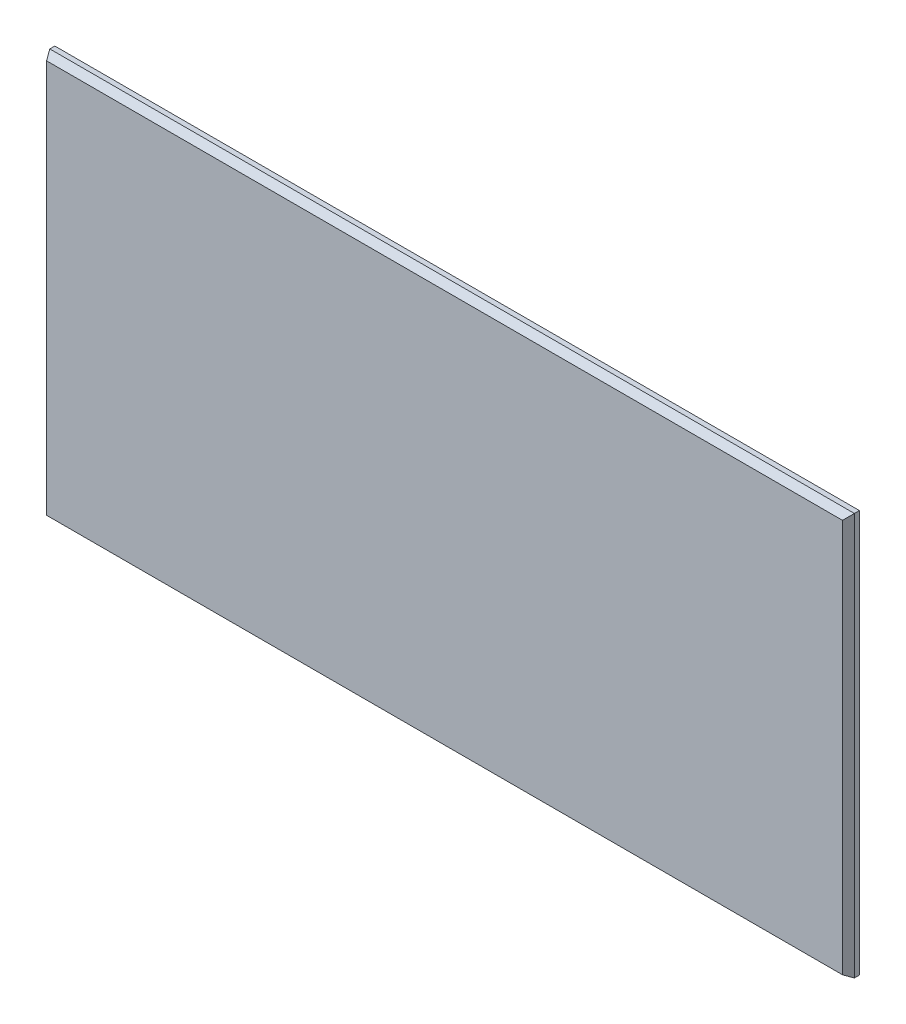
ISO-10303-21;
HEADER;
FILE_DESCRIPTION(('STEP AP214'),'2;1');
FILE_NAME('part.step','',(''),(''),'','','');
FILE_SCHEMA(('AUTOMOTIVE_DESIGN { 1 0 10303 214 1 1 1 1 }'));
ENDSEC;
DATA;
#1=APPLICATION_CONTEXT('core data for automotive mechanical design processes');
#2=APPLICATION_PROTOCOL_DEFINITION('international standard','automotive_design',2000,#1);
#3=PRODUCT_CONTEXT('',#1,'mechanical');
#4=PRODUCT('Part','Part','',(#3));
#5=PRODUCT_RELATED_PRODUCT_CATEGORY('part','',(#4));
#6=PRODUCT_DEFINITION_FORMATION('','',#4);
#7=PRODUCT_DEFINITION_CONTEXT('part definition',#1,'design');
#8=PRODUCT_DEFINITION('design','',#6,#7);
#9=PRODUCT_DEFINITION_SHAPE('','',#8);
#10=(LENGTH_UNIT() NAMED_UNIT(*) SI_UNIT(.MILLI.,.METRE.));
#11=(NAMED_UNIT(*) PLANE_ANGLE_UNIT() SI_UNIT($,.RADIAN.));
#12=(NAMED_UNIT(*) SI_UNIT($,.STERADIAN.) SOLID_ANGLE_UNIT());
#13=UNCERTAINTY_MEASURE_WITH_UNIT(LENGTH_MEASURE(1.E-05),#10,'distance_accuracy_value','');
#14=(GEOMETRIC_REPRESENTATION_CONTEXT(3) GLOBAL_UNCERTAINTY_ASSIGNED_CONTEXT((#13)) GLOBAL_UNIT_ASSIGNED_CONTEXT((#10,
#11,#12)) REPRESENTATION_CONTEXT('',''));
#15=CARTESIAN_POINT('',(0.,0.,0.));
#16=DIRECTION('',(0.,0.,1.));
#17=DIRECTION('',(1.,0.,0.));
#18=AXIS2_PLACEMENT_3D('',#15,#16,#17);
#19=CARTESIAN_POINT('',(-50.8,25.3999999999999,-0.15875));
#20=DIRECTION('',(1.,0.,0.));
#21=DIRECTION('',(0.,0.,-1.));
#22=AXIS2_PLACEMENT_3D('',#19,#20,#21);
#23=PLANE('',#22);
#24=DIRECTION('',(0.,-1.,0.));
#25=VECTOR('',#24,1.);
#26=CARTESIAN_POINT('',(-50.8,25.3999999999999,-0.79375));
#27=LINE('',#26,#25);
#28=CARTESIAN_POINT('',(-50.8,25.3999999999999,-0.79375));
#29=VERTEX_POINT('',#28);
#30=CARTESIAN_POINT('',(-50.8,-25.4000000000001,-0.79375));
#31=VERTEX_POINT('',#30);
#32=EDGE_CURVE('E115',#29,#31,#27,.T.);
#33=ORIENTED_EDGE('',*,*,#32,.T.);
#34=DIRECTION('',(0.,0.,-1.));
#35=VECTOR('',#34,1.);
#36=CARTESIAN_POINT('',(-50.8,-25.4000000000001,-0.15875));
#37=LINE('',#36,#35);
#38=CARTESIAN_POINT('',(-50.8,-25.4000000000001,-0.15875));
#39=VERTEX_POINT('',#38);
#40=EDGE_CURVE('E11',#39,#31,#37,.T.);
#41=ORIENTED_EDGE('',*,*,#40,.F.);
#42=DIRECTION('',(0.,-1.,0.));
#43=VECTOR('',#42,1.);
#44=CARTESIAN_POINT('',(-50.8,25.3999999999999,-0.15875));
#45=LINE('',#44,#43);
#46=CARTESIAN_POINT('',(-50.8,25.3999999999999,-0.15875));
#47=VERTEX_POINT('',#46);
#48=EDGE_CURVE('E94',#47,#39,#45,.T.);
#49=ORIENTED_EDGE('',*,*,#48,.F.);
#50=DIRECTION('',(0.,0.,-1.));
#51=VECTOR('',#50,1.);
#52=CARTESIAN_POINT('',(-50.8,25.3999999999999,-0.15875));
#53=LINE('',#52,#51);
#54=EDGE_CURVE('E96',#47,#29,#53,.T.);
#55=ORIENTED_EDGE('',*,*,#54,.T.);
#56=EDGE_LOOP('',(#33,#41,#49,#55));
#57=FACE_BOUND('',#56,.T.);
#58=ADVANCED_FACE('F34',(#57),#23,.F.);
#59=CARTESIAN_POINT('',(-50.8,-25.4000000000001,-0.15875));
#60=DIRECTION('',(0.,1.,0.));
#61=DIRECTION('',(0.,0.,1.));
#62=AXIS2_PLACEMENT_3D('',#59,#60,#61);
#63=PLANE('',#62);
#64=DIRECTION('',(1.,0.,0.));
#65=VECTOR('',#64,1.);
#66=CARTESIAN_POINT('',(-50.8,-25.4000000000001,-0.79375));
#67=LINE('',#66,#65);
#68=CARTESIAN_POINT('',(50.8,-25.4000000000001,-0.79375));
#69=VERTEX_POINT('',#68);
#70=EDGE_CURVE('E128',#31,#69,#67,.T.);
#71=ORIENTED_EDGE('',*,*,#70,.T.);
#72=DIRECTION('',(0.,0.,-1.));
#73=VECTOR('',#72,1.);
#74=CARTESIAN_POINT('',(50.8,-25.4000000000001,-0.15875));
#75=LINE('',#74,#73);
#76=CARTESIAN_POINT('',(50.8,-25.4000000000001,-0.15875));
#77=VERTEX_POINT('',#76);
#78=EDGE_CURVE('E42',#77,#69,#75,.T.);
#79=ORIENTED_EDGE('',*,*,#78,.F.);
#80=DIRECTION('',(1.,0.,0.));
#81=VECTOR('',#80,1.);
#82=CARTESIAN_POINT('',(-50.8,-25.4000000000001,-0.15875));
#83=LINE('',#82,#81);
#84=EDGE_CURVE('E76',#39,#77,#83,.T.);
#85=ORIENTED_EDGE('',*,*,#84,.F.);
#86=ORIENTED_EDGE('',*,*,#40,.T.);
#87=EDGE_LOOP('',(#71,#79,#85,#86));
#88=FACE_BOUND('',#87,.T.);
#89=ADVANCED_FACE('F135',(#88),#63,.F.);
#90=CARTESIAN_POINT('',(50.8,25.3999999999999,-0.15875));
#91=DIRECTION('',(-1.,0.,0.));
#92=DIRECTION('',(0.,0.,1.));
#93=AXIS2_PLACEMENT_3D('',#90,#91,#92);
#94=PLANE('',#93);
#95=DIRECTION('',(0.,1.,0.));
#96=VECTOR('',#95,1.);
#97=CARTESIAN_POINT('',(50.8,25.3999999999999,-0.79375));
#98=LINE('',#97,#96);
#99=CARTESIAN_POINT('',(50.8,25.3999999999999,-0.79375));
#100=VERTEX_POINT('',#99);
#101=EDGE_CURVE('E66',#69,#100,#98,.T.);
#102=ORIENTED_EDGE('',*,*,#101,.T.);
#103=DIRECTION('',(0.,0.,-1.));
#104=VECTOR('',#103,1.);
#105=CARTESIAN_POINT('',(50.8,25.3999999999999,-0.15875));
#106=LINE('',#105,#104);
#107=CARTESIAN_POINT('',(50.8,25.3999999999999,-0.15875));
#108=VERTEX_POINT('',#107);
#109=EDGE_CURVE('E50',#108,#100,#106,.T.);
#110=ORIENTED_EDGE('',*,*,#109,.F.);
#111=DIRECTION('',(0.,1.,0.));
#112=VECTOR('',#111,1.);
#113=CARTESIAN_POINT('',(50.8,25.3999999999999,-0.15875));
#114=LINE('',#113,#112);
#115=EDGE_CURVE('E122',#77,#108,#114,.T.);
#116=ORIENTED_EDGE('',*,*,#115,.F.);
#117=ORIENTED_EDGE('',*,*,#78,.T.);
#118=EDGE_LOOP('',(#102,#110,#116,#117));
#119=FACE_BOUND('',#118,.T.);
#120=ADVANCED_FACE('F132',(#119),#94,.F.);
#121=CARTESIAN_POINT('',(-50.8,25.3999999999999,-0.15875));
#122=DIRECTION('',(0.,-1.,0.));
#123=DIRECTION('',(0.,0.,-1.));
#124=AXIS2_PLACEMENT_3D('',#121,#122,#123);
#125=PLANE('',#124);
#126=DIRECTION('',(-1.,0.,0.));
#127=VECTOR('',#126,1.);
#128=CARTESIAN_POINT('',(-50.8,25.3999999999999,-0.79375));
#129=LINE('',#128,#127);
#130=EDGE_CURVE('E71',#100,#29,#129,.T.);
#131=ORIENTED_EDGE('',*,*,#130,.T.);
#132=ORIENTED_EDGE('',*,*,#54,.F.);
#133=DIRECTION('',(-1.,0.,0.));
#134=VECTOR('',#133,1.);
#135=CARTESIAN_POINT('',(-50.8,25.3999999999999,-0.15875));
#136=LINE('',#135,#134);
#137=EDGE_CURVE('E105',#108,#47,#136,.T.);
#138=ORIENTED_EDGE('',*,*,#137,.F.);
#139=ORIENTED_EDGE('',*,*,#109,.T.);
#140=EDGE_LOOP('',(#131,#132,#138,#139));
#141=FACE_BOUND('',#140,.T.);
#142=ADVANCED_FACE('F103',(#141),#125,.F.);
#143=CARTESIAN_POINT('',(0.,0.,-0.79375));
#144=DIRECTION('',(0.,0.,1.));
#145=DIRECTION('',(1.,0.,0.));
#146=AXIS2_PLACEMENT_3D('',#143,#144,#145);
#147=PLANE('',#146);
#148=ORIENTED_EDGE('',*,*,#32,.F.);
#149=ORIENTED_EDGE('',*,*,#130,.F.);
#150=ORIENTED_EDGE('',*,*,#101,.F.);
#151=ORIENTED_EDGE('',*,*,#70,.F.);
#152=EDGE_LOOP('',(#148,#149,#150,#151));
#153=FACE_BOUND('',#152,.T.);
#154=ADVANCED_FACE('F134',(#153),#147,.F.);
#155=CARTESIAN_POINT('',(50.8,25.3999999999999,-0.15875));
#156=DIRECTION('',(0.,0.866025403784438,0.500000000000001));
#157=DIRECTION('',(0.,-0.500000000000001,0.866025403784438));
#158=AXIS2_PLACEMENT_3D('',#155,#156,#157);
#159=PLANE('',#158);
#160=ORIENTED_EDGE('',*,*,#137,.T.);
#161=DIRECTION('',(-0.447213595499959,0.447213595499959,-0.774596669241482));
#162=VECTOR('',#161,1.);
#163=CARTESIAN_POINT('',(-50.8,25.3999999999999,-0.15875));
#164=LINE('',#163,#162);
#165=CARTESIAN_POINT('',(-50.2500738685968,24.8500738685968,0.79375));
#166=VERTEX_POINT('',#165);
#167=EDGE_CURVE('E109',#166,#47,#164,.T.);
#168=ORIENTED_EDGE('',*,*,#167,.F.);
#169=DIRECTION('',(1.,0.,0.));
#170=VECTOR('',#169,1.);
#171=CARTESIAN_POINT('',(50.8,24.8500738685968,0.79375));
#172=LINE('',#171,#170);
#173=CARTESIAN_POINT('',(50.2500738685969,24.8500738685968,0.79375));
#174=VERTEX_POINT('',#173);
#175=EDGE_CURVE('E164',#174,#166,#172,.F.);
#176=ORIENTED_EDGE('',*,*,#175,.F.);
#177=DIRECTION('',(0.447213595499959,0.447213595499959,-0.774596669241482));
#178=VECTOR('',#177,1.);
#179=CARTESIAN_POINT('',(50.8,25.3999999999999,-0.15875));
#180=LINE('',#179,#178);
#181=EDGE_CURVE('E121',#174,#108,#180,.T.);
#182=ORIENTED_EDGE('',*,*,#181,.T.);
#183=EDGE_LOOP('',(#160,#168,#176,#182));
#184=FACE_BOUND('',#183,.T.);
#185=ADVANCED_FACE('F119',(#184),#159,.T.);
#186=CARTESIAN_POINT('',(-50.8,25.3999999999999,-0.15875));
#187=DIRECTION('',(-0.866025403784438,0.,0.500000000000001));
#188=DIRECTION('',(0.500000000000001,0.,0.866025403784438));
#189=AXIS2_PLACEMENT_3D('',#186,#187,#188);
#190=PLANE('',#189);
#191=ORIENTED_EDGE('',*,*,#48,.T.);
#192=DIRECTION('',(-0.447213595499959,-0.447213595499959,-0.774596669241482));
#193=VECTOR('',#192,1.);
#194=CARTESIAN_POINT('',(-50.8,-25.4000000000001,-0.15875));
#195=LINE('',#194,#193);
#196=CARTESIAN_POINT('',(-50.2500738685968,-24.850073868597,0.79375));
#197=VERTEX_POINT('',#196);
#198=EDGE_CURVE('E116',#197,#39,#195,.T.);
#199=ORIENTED_EDGE('',*,*,#198,.F.);
#200=DIRECTION('',(0.,1.,0.));
#201=VECTOR('',#200,1.);
#202=CARTESIAN_POINT('',(-50.2500738685968,25.3999999999999,0.79375));
#203=LINE('',#202,#201);
#204=EDGE_CURVE('E111',#166,#197,#203,.F.);
#205=ORIENTED_EDGE('',*,*,#204,.F.);
#206=ORIENTED_EDGE('',*,*,#167,.T.);
#207=EDGE_LOOP('',(#191,#199,#205,#206));
#208=FACE_BOUND('',#207,.T.);
#209=ADVANCED_FACE('F110',(#208),#190,.T.);
#210=CARTESIAN_POINT('',(-50.8,-25.4000000000001,-0.15875));
#211=DIRECTION('',(0.,-0.866025403784438,0.500000000000001));
#212=DIRECTION('',(0.,-0.500000000000001,-0.866025403784438));
#213=AXIS2_PLACEMENT_3D('',#210,#211,#212);
#214=PLANE('',#213);
#215=ORIENTED_EDGE('',*,*,#84,.T.);
#216=DIRECTION('',(0.447213595499959,-0.447213595499959,-0.774596669241482));
#217=VECTOR('',#216,1.);
#218=CARTESIAN_POINT('',(50.8,-25.4000000000001,-0.15875));
#219=LINE('',#218,#217);
#220=CARTESIAN_POINT('',(50.2500738685969,-24.850073868597,0.79375));
#221=VERTEX_POINT('',#220);
#222=EDGE_CURVE('E177',#221,#77,#219,.T.);
#223=ORIENTED_EDGE('',*,*,#222,.F.);
#224=DIRECTION('',(-1.,0.,0.));
#225=VECTOR('',#224,1.);
#226=CARTESIAN_POINT('',(-50.8,-24.850073868597,0.79375));
#227=LINE('',#226,#225);
#228=EDGE_CURVE('E168',#197,#221,#227,.F.);
#229=ORIENTED_EDGE('',*,*,#228,.F.);
#230=ORIENTED_EDGE('',*,*,#198,.T.);
#231=EDGE_LOOP('',(#215,#223,#229,#230));
#232=FACE_BOUND('',#231,.T.);
#233=ADVANCED_FACE('F149',(#232),#214,.T.);
#234=CARTESIAN_POINT('',(50.8,-25.4000000000001,-0.15875));
#235=DIRECTION('',(0.866025403784438,0.,0.500000000000001));
#236=DIRECTION('',(0.500000000000001,0.,-0.866025403784438));
#237=AXIS2_PLACEMENT_3D('',#234,#235,#236);
#238=PLANE('',#237);
#239=ORIENTED_EDGE('',*,*,#115,.T.);
#240=ORIENTED_EDGE('',*,*,#181,.F.);
#241=DIRECTION('',(0.,-1.,0.));
#242=VECTOR('',#241,1.);
#243=CARTESIAN_POINT('',(50.2500738685969,-25.4000000000001,0.79375));
#244=LINE('',#243,#242);
#245=EDGE_CURVE('E166',#221,#174,#244,.F.);
#246=ORIENTED_EDGE('',*,*,#245,.F.);
#247=ORIENTED_EDGE('',*,*,#222,.T.);
#248=EDGE_LOOP('',(#239,#240,#246,#247));
#249=FACE_BOUND('',#248,.T.);
#250=ADVANCED_FACE('F152',(#249),#238,.T.);
#251=CARTESIAN_POINT('',(0.,0.,0.79375));
#252=DIRECTION('',(0.,0.,1.));
#253=DIRECTION('',(1.,0.,0.));
#254=AXIS2_PLACEMENT_3D('',#251,#252,#253);
#255=PLANE('',#254);
#256=ORIENTED_EDGE('',*,*,#175,.T.);
#257=ORIENTED_EDGE('',*,*,#204,.T.);
#258=ORIENTED_EDGE('',*,*,#228,.T.);
#259=ORIENTED_EDGE('',*,*,#245,.T.);
#260=EDGE_LOOP('',(#256,#257,#258,#259));
#261=FACE_BOUND('',#260,.T.);
#262=ADVANCED_FACE('F156',(#261),#255,.T.);
#263=CLOSED_SHELL('',(#58,#89,#120,#142,#154,#185,#209,#233,#250,#262));
#264=MANIFOLD_SOLID_BREP('B2',#263);
#265=ADVANCED_BREP_SHAPE_REPRESENTATION('',(#18,#264),#14);
#266=SHAPE_DEFINITION_REPRESENTATION(#9,#265);
ENDSEC;
END-ISO-10303-21;
